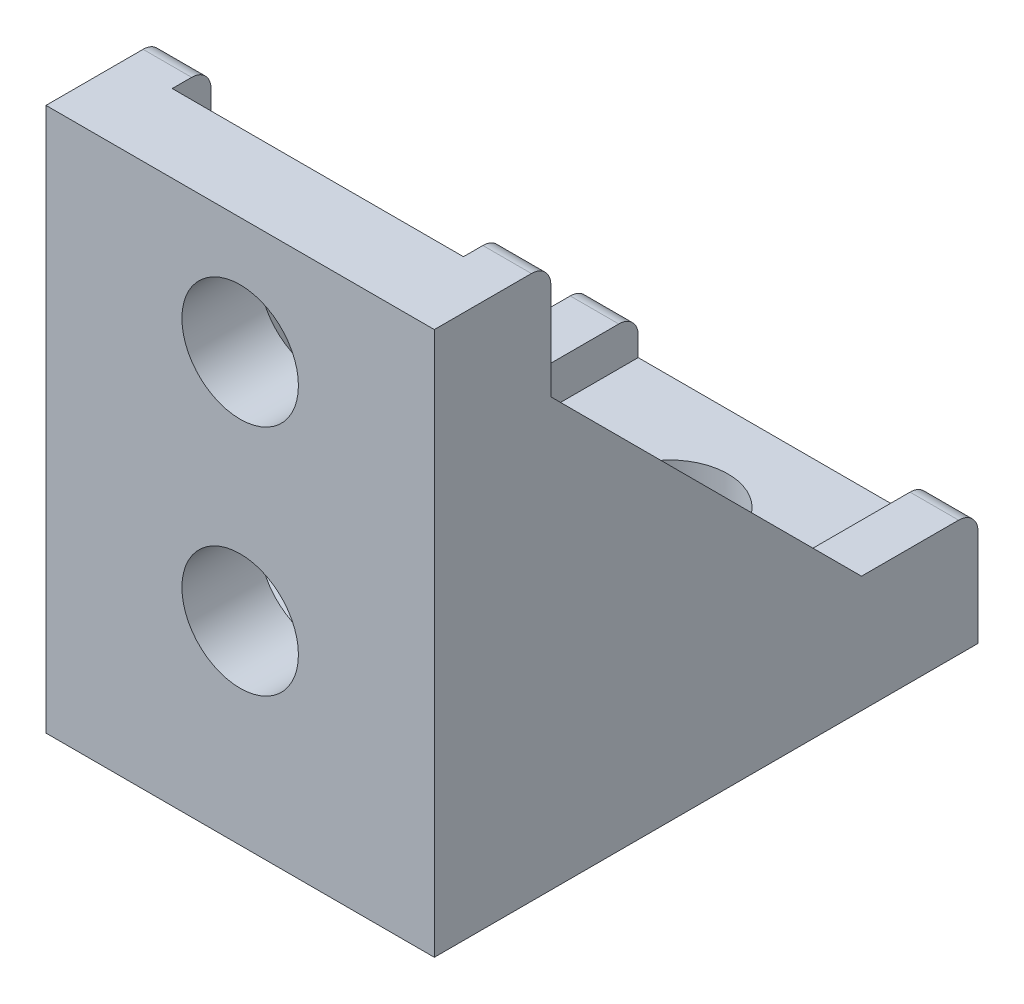
ISO-10303-21;
HEADER;
FILE_DESCRIPTION(('STEP AP214'),'2;1');
FILE_NAME('part.step','',(''),(''),'','','');
FILE_SCHEMA(('AUTOMOTIVE_DESIGN { 1 0 10303 214 1 1 1 1 }'));
ENDSEC;
DATA;
#1=APPLICATION_CONTEXT('core data for automotive mechanical design processes');
#2=APPLICATION_PROTOCOL_DEFINITION('international standard','automotive_design',2000,#1);
#3=PRODUCT_CONTEXT('',#1,'mechanical');
#4=PRODUCT('Part','Part','',(#3));
#5=PRODUCT_RELATED_PRODUCT_CATEGORY('part','',(#4));
#6=PRODUCT_DEFINITION_FORMATION('','',#4);
#7=PRODUCT_DEFINITION_CONTEXT('part definition',#1,'design');
#8=PRODUCT_DEFINITION('design','',#6,#7);
#9=PRODUCT_DEFINITION_SHAPE('','',#8);
#10=(LENGTH_UNIT() NAMED_UNIT(*) SI_UNIT(.MILLI.,.METRE.));
#11=(NAMED_UNIT(*) PLANE_ANGLE_UNIT() SI_UNIT($,.RADIAN.));
#12=(NAMED_UNIT(*) SI_UNIT($,.STERADIAN.) SOLID_ANGLE_UNIT());
#13=UNCERTAINTY_MEASURE_WITH_UNIT(LENGTH_MEASURE(1.E-05),#10,'distance_accuracy_value','');
#14=(GEOMETRIC_REPRESENTATION_CONTEXT(3) GLOBAL_UNCERTAINTY_ASSIGNED_CONTEXT((#13)) GLOBAL_UNIT_ASSIGNED_CONTEXT((#10,
#11,#12)) REPRESENTATION_CONTEXT('',''));
#15=CARTESIAN_POINT('',(0.,0.,0.));
#16=DIRECTION('',(0.,0.,1.));
#17=DIRECTION('',(1.,0.,0.));
#18=AXIS2_PLACEMENT_3D('',#15,#16,#17);
#19=CARTESIAN_POINT('',(0.,-6.00000000000142,-22.1235464085107));
#20=DIRECTION('',(0.,1.,0.));
#21=DIRECTION('',(0.,0.,1.));
#22=AXIS2_PLACEMENT_3D('',#19,#20,#21);
#23=CYLINDRICAL_SURFACE('',#22,3.);
#24=CARTESIAN_POINT('',(0.,3.99999999999858,-22.1235464085107));
#25=DIRECTION('',(0.,1.,0.));
#26=DIRECTION('',(0.,0.,1.));
#27=AXIS2_PLACEMENT_3D('',#24,#25,#26);
#28=CIRCLE('',#27,3.);
#29=CARTESIAN_POINT('',(0.,3.99999999999858,-19.1235464085107));
#30=VERTEX_POINT('',#29);
#31=EDGE_CURVE('E754',#30,#30,#28,.T.);
#32=ORIENTED_EDGE('',*,*,#31,.T.);
#33=EDGE_LOOP('',(#32));
#34=FACE_BOUND('',#33,.T.);
#35=CARTESIAN_POINT('',(0.,-1.94289029309402E-13,-22.1235464085107));
#36=DIRECTION('',(0.,1.,0.));
#37=DIRECTION('',(-1.,0.,0.));
#38=AXIS2_PLACEMENT_3D('',#35,#36,#37);
#39=CIRCLE('',#38,3.);
#40=CARTESIAN_POINT('',(-3.,-4.2717565595929E-13,-22.1235464085107));
#41=VERTEX_POINT('',#40);
#42=EDGE_CURVE('E750',#41,#41,#39,.T.);
#43=ORIENTED_EDGE('',*,*,#42,.F.);
#44=EDGE_LOOP('',(#43));
#45=FACE_BOUND('',#44,.T.);
#46=ADVANCED_FACE('F43',(#34,#45),#23,.F.);
#47=CARTESIAN_POINT('',(0.,-1.94289029309402E-13,0.));
#48=DIRECTION('',(0.,1.,0.));
#49=DIRECTION('',(-1.,0.,0.));
#50=AXIS2_PLACEMENT_3D('',#47,#48,#49);
#51=PLANE('',#50);
#52=ORIENTED_EDGE('',*,*,#42,.T.);
#53=EDGE_LOOP('',(#52));
#54=FACE_BOUND('',#53,.T.);
#55=CARTESIAN_POINT('',(0.,-1.94289029309402E-13,-10.0000000000007));
#56=DIRECTION('',(0.,1.,0.));
#57=DIRECTION('',(-1.,0.,0.));
#58=AXIS2_PLACEMENT_3D('',#55,#56,#57);
#59=CIRCLE('',#58,3.);
#60=CARTESIAN_POINT('',(-3.,-4.2717565595929E-13,-10.0000000000007));
#61=VERTEX_POINT('',#60);
#62=EDGE_CURVE('E743',#61,#61,#59,.T.);
#63=ORIENTED_EDGE('',*,*,#62,.T.);
#64=EDGE_LOOP('',(#63));
#65=FACE_BOUND('',#64,.T.);
#66=DIRECTION('',(1.,0.,0.));
#67=VECTOR('',#66,1.);
#68=CARTESIAN_POINT('',(10.0000000000009,5.81999726190219E-13,-28.));
#69=LINE('',#68,#67);
#70=CARTESIAN_POINT('',(-9.99999999999907,-9.70577784809024E-13,-28.));
#71=VERTEX_POINT('',#70);
#72=CARTESIAN_POINT('',(10.0000000000009,5.81999726190219E-13,-28.));
#73=VERTEX_POINT('',#72);
#74=EDGE_CURVE('E259',#71,#73,#69,.T.);
#75=ORIENTED_EDGE('',*,*,#74,.T.);
#76=DIRECTION('',(0.,0.,1.));
#77=VECTOR('',#76,1.);
#78=CARTESIAN_POINT('',(10.0000000000009,5.81999726190219E-13,0.));
#79=LINE('',#78,#77);
#80=CARTESIAN_POINT('',(10.0000000000009,5.81999726190219E-13,0.));
#81=VERTEX_POINT('',#80);
#82=EDGE_CURVE('E263',#73,#81,#79,.T.);
#83=ORIENTED_EDGE('',*,*,#82,.T.);
#84=DIRECTION('',(-1.,0.,0.));
#85=VECTOR('',#84,1.);
#86=CARTESIAN_POINT('',(-9.99999999999892,-9.70577784809024E-13,1.91624494050302E-13));
#87=LINE('',#86,#85);
#88=CARTESIAN_POINT('',(-9.99999999999892,-9.70577784809024E-13,1.91624494050302E-13));
#89=VERTEX_POINT('',#88);
#90=EDGE_CURVE('E267',#81,#89,#87,.T.);
#91=ORIENTED_EDGE('',*,*,#90,.T.);
#92=DIRECTION('',(0.,0.,-1.));
#93=VECTOR('',#92,1.);
#94=CARTESIAN_POINT('',(-9.99999999999907,-9.70577784809024E-13,-28.));
#95=LINE('',#94,#93);
#96=EDGE_CURVE('E255',#89,#71,#95,.T.);
#97=ORIENTED_EDGE('',*,*,#96,.T.);
#98=EDGE_LOOP('',(#75,#83,#91,#97));
#99=FACE_BOUND('',#98,.T.);
#100=ADVANCED_FACE('F395',(#54,#65,#99),#51,.F.);
#101=CARTESIAN_POINT('',(0.,0.,-6.00000000000071));
#102=DIRECTION('',(0.,0.,1.));
#103=DIRECTION('',(1.,0.,0.));
#104=AXIS2_PLACEMENT_3D('',#101,#102,#103);
#105=PLANE('',#104);
#106=DIRECTION('',(0.,1.,0.));
#107=VECTOR('',#106,1.);
#108=CARTESIAN_POINT('',(7.50000000000009,5.99999999999793,-6.00000000000073));
#109=LINE('',#108,#107);
#110=CARTESIAN_POINT('',(7.50000000000009,21.9999999999992,-6.00000000000072));
#111=VERTEX_POINT('',#110);
#112=CARTESIAN_POINT('',(7.50000000000009,27.0000000000001,-6.00000000000071));
#113=VERTEX_POINT('',#112);
#114=EDGE_CURVE('E242',#111,#113,#109,.T.);
#115=ORIENTED_EDGE('',*,*,#114,.T.);
#116=DIRECTION('',(-1.,0.,0.));
#117=VECTOR('',#116,1.);
#118=CARTESIAN_POINT('',(9.99999999999864,26.9999999999999,-6.00000000000071));
#119=LINE('',#118,#117);
#120=CARTESIAN_POINT('',(9.99999999999864,26.9999999999999,-6.00000000000048));
#121=VERTEX_POINT('',#120);
#122=EDGE_CURVE('E11',#113,#121,#119,.F.);
#123=ORIENTED_EDGE('',*,*,#122,.T.);
#124=DIRECTION('',(0.,-1.,0.));
#125=VECTOR('',#124,1.);
#126=CARTESIAN_POINT('',(9.99999999999872,27.9999999999999,-6.00000000000048));
#127=LINE('',#126,#125);
#128=CARTESIAN_POINT('',(10.0000000000006,21.9999999999989,-6.00000000000097));
#129=VERTEX_POINT('',#128);
#130=EDGE_CURVE('E290',#121,#129,#127,.T.);
#131=ORIENTED_EDGE('',*,*,#130,.T.);
#132=DIRECTION('',(-1.,0.,0.));
#133=VECTOR('',#132,1.);
#134=CARTESIAN_POINT('',(10.0000000000006,21.9999999999989,-6.00000000000097));
#135=LINE('',#134,#133);
#136=EDGE_CURVE('E301',#129,#111,#135,.T.);
#137=ORIENTED_EDGE('',*,*,#136,.T.);
#138=EDGE_LOOP('',(#115,#123,#131,#137));
#139=FACE_BOUND('',#138,.T.);
#140=ADVANCED_FACE('F408',(#139),#105,.F.);
#141=CARTESIAN_POINT('',(-9.99999999999985,22.0000000000007,-6.00000000000071));
#142=DIRECTION('',(-1.,0.,0.));
#143=DIRECTION('',(0.,-1.,0.));
#144=AXIS2_PLACEMENT_3D('',#141,#142,#143);
#145=PLANE('',#144);
#146=DIRECTION('',(0.,0.,1.));
#147=VECTOR('',#146,1.);
#148=CARTESIAN_POINT('',(-9.99999999999985,5.99999999999859,-28.));
#149=LINE('',#148,#147);
#150=CARTESIAN_POINT('',(-9.99999999999985,5.99999999999859,-26.9999999999998));
#151=VERTEX_POINT('',#150);
#152=CARTESIAN_POINT('',(-9.99999999999985,5.99999999999859,-22.));
#153=VERTEX_POINT('',#152);
#154=EDGE_CURVE('E169',#151,#153,#149,.T.);
#155=ORIENTED_EDGE('',*,*,#154,.F.);
#156=CARTESIAN_POINT('',(-9.99999999999985,4.99999999999859,-26.9999999999998));
#157=DIRECTION('',(-1.,0.,0.));
#158=DIRECTION('',(0.,-1.,0.));
#159=AXIS2_PLACEMENT_3D('',#156,#157,#158);
#160=CIRCLE('',#159,1.);
#161=CARTESIAN_POINT('',(-10.0000000000004,4.99999999999859,-27.9999999999998));
#162=VERTEX_POINT('',#161);
#163=EDGE_CURVE('E332',#151,#162,#160,.T.);
#164=ORIENTED_EDGE('',*,*,#163,.T.);
#165=DIRECTION('',(0.,1.,0.));
#166=VECTOR('',#165,1.);
#167=CARTESIAN_POINT('',(-10.0000000000005,21.9999999999993,-27.9999999999998));
#168=LINE('',#167,#166);
#169=EDGE_CURVE('E309',#71,#162,#168,.T.);
#170=ORIENTED_EDGE('',*,*,#169,.F.);
#171=ORIENTED_EDGE('',*,*,#96,.F.);
#172=DIRECTION('',(0.,-1.,0.));
#173=VECTOR('',#172,1.);
#174=CARTESIAN_POINT('',(-9.99999999999985,22.0000000000007,0.));
#175=LINE('',#174,#173);
#176=CARTESIAN_POINT('',(-10.0000000000016,28.0000000000014,-5.80702153030188E-13));
#177=VERTEX_POINT('',#176);
#178=EDGE_CURVE('E313',#177,#89,#175,.T.);
#179=ORIENTED_EDGE('',*,*,#178,.F.);
#180=DIRECTION('',(0.,0.,1.));
#181=VECTOR('',#180,1.);
#182=CARTESIAN_POINT('',(-10.0000000000016,28.0000000000014,-5.80702153030188E-13));
#183=LINE('',#182,#181);
#184=CARTESIAN_POINT('',(-10.0000000000016,28.0000000000014,-5.00000000000044));
#185=VERTEX_POINT('',#184);
#186=EDGE_CURVE('E280',#185,#177,#183,.T.);
#187=ORIENTED_EDGE('',*,*,#186,.F.);
#188=CARTESIAN_POINT('',(-9.99999999999985,27.0000000000015,-5.00000000000044));
#189=DIRECTION('',(-1.,0.,0.));
#190=DIRECTION('',(0.,-1.,0.));
#191=AXIS2_PLACEMENT_3D('',#188,#189,#190);
#192=CIRCLE('',#191,1.);
#193=CARTESIAN_POINT('',(-9.99999999999985,27.0000000000014,-6.00000000000044));
#194=VERTEX_POINT('',#193);
#195=EDGE_CURVE('E329',#185,#194,#192,.T.);
#196=ORIENTED_EDGE('',*,*,#195,.T.);
#197=DIRECTION('',(0.,1.,0.));
#198=VECTOR('',#197,1.);
#199=CARTESIAN_POINT('',(-9.99999999999985,21.9999999999984,-6.00000000000023));
#200=LINE('',#199,#198);
#201=CARTESIAN_POINT('',(-9.99999999999985,21.9999999999984,-6.00000000000023));
#202=VERTEX_POINT('',#201);
#203=EDGE_CURVE('E192',#202,#194,#200,.T.);
#204=ORIENTED_EDGE('',*,*,#203,.F.);
#205=DIRECTION('',(0.,0.707106781186547,0.707106781186547));
#206=VECTOR('',#205,1.);
#207=CARTESIAN_POINT('',(-9.99999999999985,5.99999999999859,-22.));
#208=LINE('',#207,#206);
#209=EDGE_CURVE('E179',#153,#202,#208,.T.);
#210=ORIENTED_EDGE('',*,*,#209,.F.);
#211=EDGE_LOOP('',(#155,#164,#170,#171,#179,#187,#196,#204,#210));
#212=FACE_BOUND('',#211,.T.);
#213=ADVANCED_FACE('F194',(#212),#145,.T.);
#214=CARTESIAN_POINT('',(0.,0.,0.));
#215=DIRECTION('',(0.,0.,1.));
#216=DIRECTION('',(1.,0.,0.));
#217=AXIS2_PLACEMENT_3D('',#214,#215,#216);
#218=PLANE('',#217);
#219=CARTESIAN_POINT('',(0.,21.9999999999983,0.));
#220=DIRECTION('',(0.,0.,1.));
#221=DIRECTION('',(1.,0.,0.));
#222=AXIS2_PLACEMENT_3D('',#219,#220,#221);
#223=CIRCLE('',#222,3.);
#224=CARTESIAN_POINT('',(3.,21.9999999999983,0.));
#225=VERTEX_POINT('',#224);
#226=EDGE_CURVE('E731',#225,#225,#223,.T.);
#227=ORIENTED_EDGE('',*,*,#226,.F.);
#228=EDGE_LOOP('',(#227));
#229=FACE_BOUND('',#228,.T.);
#230=CARTESIAN_POINT('',(0.,9.99999999999827,0.));
#231=DIRECTION('',(0.,0.,1.));
#232=DIRECTION('',(1.,0.,0.));
#233=AXIS2_PLACEMENT_3D('',#230,#231,#232);
#234=CIRCLE('',#233,3.);
#235=CARTESIAN_POINT('',(3.,9.99999999999827,0.));
#236=VERTEX_POINT('',#235);
#237=EDGE_CURVE('E180',#236,#236,#234,.T.);
#238=ORIENTED_EDGE('',*,*,#237,.F.);
#239=EDGE_LOOP('',(#238));
#240=FACE_BOUND('',#239,.T.);
#241=ORIENTED_EDGE('',*,*,#178,.T.);
#242=ORIENTED_EDGE('',*,*,#90,.F.);
#243=DIRECTION('',(0.,-1.,0.));
#244=VECTOR('',#243,1.);
#245=CARTESIAN_POINT('',(10.0000000000004,5.99999999999989,0.));
#246=LINE('',#245,#244);
#247=CARTESIAN_POINT('',(9.9999999999989,27.9999999999999,-5.80702153030188E-13));
#248=VERTEX_POINT('',#247);
#249=EDGE_CURVE('E294',#248,#81,#246,.T.);
#250=ORIENTED_EDGE('',*,*,#249,.F.);
#251=DIRECTION('',(1.,0.,0.));
#252=VECTOR('',#251,1.);
#253=CARTESIAN_POINT('',(9.9999999999989,27.9999999999999,-5.80702153030188E-13));
#254=LINE('',#253,#252);
#255=EDGE_CURVE('E283',#177,#248,#254,.T.);
#256=ORIENTED_EDGE('',*,*,#255,.F.);
#257=EDGE_LOOP('',(#241,#242,#250,#256));
#258=FACE_BOUND('',#257,.T.);
#259=ADVANCED_FACE('F399',(#229,#240,#258),#218,.T.);
#260=CARTESIAN_POINT('',(-7.50000000000009,5.9999999999988,-27.9999999999999));
#261=DIRECTION('',(-1.,0.,0.));
#262=DIRECTION('',(0.,0.,1.));
#263=AXIS2_PLACEMENT_3D('',#260,#261,#262);
#264=PLANE('',#263);
#265=DIRECTION('',(0.,-1.,0.));
#266=VECTOR('',#265,1.);
#267=CARTESIAN_POINT('',(-7.50000000000009,5.9999999999988,-27.9999999999999));
#268=LINE('',#267,#266);
#269=CARTESIAN_POINT('',(-7.50000000000009,4.99999999999859,-27.9999999999999));
#270=VERTEX_POINT('',#269);
#271=CARTESIAN_POINT('',(-7.50000000000015,3.99999999999858,-28.0000000000006));
#272=VERTEX_POINT('',#271);
#273=EDGE_CURVE('E306',#270,#272,#268,.T.);
#274=ORIENTED_EDGE('',*,*,#273,.F.);
#275=CARTESIAN_POINT('',(-7.50000000000008,4.99999999999859,-26.9999999999999));
#276=DIRECTION('',(-1.,0.,0.));
#277=DIRECTION('',(0.,0.,1.));
#278=AXIS2_PLACEMENT_3D('',#275,#276,#277);
#279=CIRCLE('',#278,1.);
#280=CARTESIAN_POINT('',(-7.50000000000008,5.9999999999988,-26.9999999999999));
#281=VERTEX_POINT('',#280);
#282=EDGE_CURVE('E345',#270,#281,#279,.F.);
#283=ORIENTED_EDGE('',*,*,#282,.T.);
#284=DIRECTION('',(0.,0.,1.));
#285=VECTOR('',#284,1.);
#286=CARTESIAN_POINT('',(-7.50000000000009,5.9999999999988,-27.9999999999999));
#287=LINE('',#286,#285);
#288=CARTESIAN_POINT('',(-7.50000000000006,5.99999999999859,-22.));
#289=VERTEX_POINT('',#288);
#290=EDGE_CURVE('E212',#281,#289,#287,.T.);
#291=ORIENTED_EDGE('',*,*,#290,.T.);
#292=DIRECTION('',(0.,0.707106781186548,0.707106781186548));
#293=VECTOR('',#292,1.);
#294=CARTESIAN_POINT('',(-7.50000000000006,2.99999999999876,-24.9999999999998));
#295=LINE('',#294,#293);
#296=CARTESIAN_POINT('',(-7.49999999999993,21.9999999999984,-6.00000000000023));
#297=VERTEX_POINT('',#296);
#298=EDGE_CURVE('E189',#289,#297,#295,.T.);
#299=ORIENTED_EDGE('',*,*,#298,.T.);
#300=DIRECTION('',(0.,1.,0.));
#301=VECTOR('',#300,1.);
#302=CARTESIAN_POINT('',(-7.49999999999985,5.9999999999997,-5.99999999999958));
#303=LINE('',#302,#301);
#304=CARTESIAN_POINT('',(-7.49999999999983,27.0000000000012,-6.00000000000044));
#305=VERTEX_POINT('',#304);
#306=EDGE_CURVE('E208',#297,#305,#303,.T.);
#307=ORIENTED_EDGE('',*,*,#306,.T.);
#308=CARTESIAN_POINT('',(-7.49999999999982,27.0000000000013,-5.00000000000044));
#309=DIRECTION('',(-1.,0.,0.));
#310=DIRECTION('',(0.,0.,1.));
#311=AXIS2_PLACEMENT_3D('',#308,#309,#310);
#312=CIRCLE('',#311,1.);
#313=CARTESIAN_POINT('',(-7.50000000000143,28.0000000000013,-5.00000000000044));
#314=VERTEX_POINT('',#313);
#315=EDGE_CURVE('E342',#305,#314,#312,.F.);
#316=ORIENTED_EDGE('',*,*,#315,.T.);
#317=DIRECTION('',(0.,0.,-1.));
#318=VECTOR('',#317,1.);
#319=CARTESIAN_POINT('',(-7.50000000000119,28.0000000000013,-28.));
#320=LINE('',#319,#318);
#321=CARTESIAN_POINT('',(-7.50000000000014,27.999999999998,-4.00000000000069));
#322=VERTEX_POINT('',#321);
#323=EDGE_CURVE('E276',#322,#314,#320,.T.);
#324=ORIENTED_EDGE('',*,*,#323,.F.);
#325=DIRECTION('',(0.,-1.,0.));
#326=VECTOR('',#325,1.);
#327=CARTESIAN_POINT('',(-7.50000000000014,27.999999999998,-4.00000000000069));
#328=LINE('',#327,#326);
#329=CARTESIAN_POINT('',(-7.50000000000016,3.99999999999859,-4.00000000000056));
#330=VERTEX_POINT('',#329);
#331=EDGE_CURVE('E235',#322,#330,#328,.T.);
#332=ORIENTED_EDGE('',*,*,#331,.T.);
#333=DIRECTION('',(0.,0.,-1.));
#334=VECTOR('',#333,1.);
#335=CARTESIAN_POINT('',(-7.50000000000016,3.99999999999859,-4.00000000000056));
#336=LINE('',#335,#334);
#337=EDGE_CURVE('E225',#330,#272,#336,.T.);
#338=ORIENTED_EDGE('',*,*,#337,.T.);
#339=EDGE_LOOP('',(#274,#283,#291,#299,#307,#316,#324,#332,#338));
#340=FACE_BOUND('',#339,.T.);
#341=ADVANCED_FACE('F384',(#340),#264,.F.);
#342=CARTESIAN_POINT('',(-3.14645135343223E-13,0.,-28.));
#343=DIRECTION('',(0.,0.,1.));
#344=DIRECTION('',(1.,0.,0.));
#345=AXIS2_PLACEMENT_3D('',#342,#343,#344);
#346=PLANE('',#345);
#347=DIRECTION('',(0.,1.,0.));
#348=VECTOR('',#347,1.);
#349=CARTESIAN_POINT('',(10.0000000000009,5.81999726190219E-13,-28.));
#350=LINE('',#349,#348);
#351=CARTESIAN_POINT('',(10.0000000000005,4.99999999999945,-28.));
#352=VERTEX_POINT('',#351);
#353=EDGE_CURVE('E270',#73,#352,#350,.T.);
#354=ORIENTED_EDGE('',*,*,#353,.F.);
#355=ORIENTED_EDGE('',*,*,#74,.F.);
#356=ORIENTED_EDGE('',*,*,#169,.T.);
#357=DIRECTION('',(-1.,0.,0.));
#358=VECTOR('',#357,1.);
#359=CARTESIAN_POINT('',(-3.15729337515708E-13,4.99999999999859,-28.));
#360=LINE('',#359,#358);
#361=EDGE_CURVE('E339',#162,#270,#360,.F.);
#362=ORIENTED_EDGE('',*,*,#361,.T.);
#363=ORIENTED_EDGE('',*,*,#273,.T.);
#364=DIRECTION('',(1.,0.,0.));
#365=VECTOR('',#364,1.);
#366=CARTESIAN_POINT('',(-7.50000000000015,3.99999999999858,-28.0000000000006));
#367=LINE('',#366,#365);
#368=CARTESIAN_POINT('',(7.50000000000017,3.99999999999858,-28.0000000000005));
#369=VERTEX_POINT('',#368);
#370=EDGE_CURVE('E221',#272,#369,#367,.T.);
#371=ORIENTED_EDGE('',*,*,#370,.T.);
#372=DIRECTION('',(0.,-1.,0.));
#373=VECTOR('',#372,1.);
#374=CARTESIAN_POINT('',(7.50000000000017,34.3019433961686,-28.0000000000005));
#375=LINE('',#374,#373);
#376=CARTESIAN_POINT('',(7.50000000000017,4.99999999999926,-28.0000000000005));
#377=VERTEX_POINT('',#376);
#378=EDGE_CURVE('E220',#377,#369,#375,.T.);
#379=ORIENTED_EDGE('',*,*,#378,.F.);
#380=DIRECTION('',(1.,0.,0.));
#381=VECTOR('',#380,1.);
#382=CARTESIAN_POINT('',(10.0000000000005,4.99999999999945,-28.0000000000001));
#383=LINE('',#382,#381);
#384=EDGE_CURVE('E335',#377,#352,#383,.T.);
#385=ORIENTED_EDGE('',*,*,#384,.T.);
#386=EDGE_LOOP('',(#354,#355,#356,#362,#363,#371,#379,#385));
#387=FACE_BOUND('',#386,.T.);
#388=ADVANCED_FACE('F392',(#387),#346,.F.);
#389=CARTESIAN_POINT('',(7.50000000000016,0.,0.));
#390=DIRECTION('',(1.,0.,0.));
#391=DIRECTION('',(0.,1.,0.));
#392=AXIS2_PLACEMENT_3D('',#389,#390,#391);
#393=PLANE('',#392);
#394=DIRECTION('',(0.,0.,1.));
#395=VECTOR('',#394,1.);
#396=CARTESIAN_POINT('',(7.50000000000017,5.99999999999856,-28.0000000000005));
#397=LINE('',#396,#395);
#398=CARTESIAN_POINT('',(7.50000000000017,5.99999999999856,-27.));
#399=VERTEX_POINT('',#398);
#400=CARTESIAN_POINT('',(7.50000000000015,5.99999999999856,-22.));
#401=VERTEX_POINT('',#400);
#402=EDGE_CURVE('E232',#399,#401,#397,.T.);
#403=ORIENTED_EDGE('',*,*,#402,.F.);
#404=CARTESIAN_POINT('',(7.50000000000021,4.99999999999925,-27.));
#405=DIRECTION('',(1.,0.,0.));
#406=DIRECTION('',(0.,1.,0.));
#407=AXIS2_PLACEMENT_3D('',#404,#405,#406);
#408=CIRCLE('',#407,1.);
#409=EDGE_CURVE('E359',#399,#377,#408,.F.);
#410=ORIENTED_EDGE('',*,*,#409,.T.);
#411=ORIENTED_EDGE('',*,*,#378,.T.);
#412=DIRECTION('',(0.,0.,1.));
#413=VECTOR('',#412,1.);
#414=CARTESIAN_POINT('',(7.50000000000017,3.99999999999858,-28.0000000000005));
#415=LINE('',#414,#413);
#416=CARTESIAN_POINT('',(7.50000000000009,3.99999999999859,-4.00000000000045));
#417=VERTEX_POINT('',#416);
#418=EDGE_CURVE('E216',#369,#417,#415,.T.);
#419=ORIENTED_EDGE('',*,*,#418,.T.);
#420=DIRECTION('',(0.,1.,0.));
#421=VECTOR('',#420,1.);
#422=CARTESIAN_POINT('',(7.50000000000009,5.99999999999795,-4.00000000000069));
#423=LINE('',#422,#421);
#424=CARTESIAN_POINT('',(7.50000000000009,27.999999999998,-4.00000000000069));
#425=VERTEX_POINT('',#424);
#426=EDGE_CURVE('E243',#417,#425,#423,.T.);
#427=ORIENTED_EDGE('',*,*,#426,.T.);
#428=DIRECTION('',(0.,0.,1.));
#429=VECTOR('',#428,1.);
#430=CARTESIAN_POINT('',(7.50000000000009,27.999999999998,-32.6270539113896));
#431=LINE('',#430,#429);
#432=CARTESIAN_POINT('',(7.50000000000009,27.999999999998,-5.00000000000071));
#433=VERTEX_POINT('',#432);
#434=EDGE_CURVE('E251',#433,#425,#431,.T.);
#435=ORIENTED_EDGE('',*,*,#434,.F.);
#436=CARTESIAN_POINT('',(7.50000000000046,27.0000000000001,-5.00000000000071));
#437=DIRECTION('',(1.,0.,0.));
#438=DIRECTION('',(0.,1.,0.));
#439=AXIS2_PLACEMENT_3D('',#436,#437,#438);
#440=CIRCLE('',#439,1.);
#441=EDGE_CURVE('E59',#433,#113,#440,.F.);
#442=ORIENTED_EDGE('',*,*,#441,.T.);
#443=ORIENTED_EDGE('',*,*,#114,.F.);
#444=DIRECTION('',(0.,0.707106781186547,0.707106781186548));
#445=VECTOR('',#444,1.);
#446=CARTESIAN_POINT('',(7.5000000000004,21.9999999999989,-6.00000000000097));
#447=LINE('',#446,#445);
#448=EDGE_CURVE('E293',#401,#111,#447,.T.);
#449=ORIENTED_EDGE('',*,*,#448,.F.);
#450=EDGE_LOOP('',(#403,#410,#411,#419,#427,#435,#442,#443,#449));
#451=FACE_BOUND('',#450,.T.);
#452=ADVANCED_FACE('F411',(#451),#393,.F.);
#453=CARTESIAN_POINT('',(10.0000000000006,21.9999999999989,-6.00000000000097));
#454=DIRECTION('',(0.,-0.707106781186548,0.707106781186547));
#455=DIRECTION('',(0.,-0.707106781186547,-0.707106781186548));
#456=AXIS2_PLACEMENT_3D('',#453,#454,#455);
#457=PLANE('',#456);
#458=ORIENTED_EDGE('',*,*,#448,.T.);
#459=ORIENTED_EDGE('',*,*,#136,.F.);
#460=DIRECTION('',(0.,0.707106781186547,0.707106781186548));
#461=VECTOR('',#460,1.);
#462=CARTESIAN_POINT('',(10.0000000000006,21.9999999999989,-6.00000000000097));
#463=LINE('',#462,#461);
#464=CARTESIAN_POINT('',(10.0000000000005,5.99999999999945,-22.));
#465=VERTEX_POINT('',#464);
#466=EDGE_CURVE('E297',#465,#129,#463,.T.);
#467=ORIENTED_EDGE('',*,*,#466,.F.);
#468=DIRECTION('',(-1.,0.,0.));
#469=VECTOR('',#468,1.);
#470=CARTESIAN_POINT('',(10.0000000000004,5.99999999999989,-22.));
#471=LINE('',#470,#469);
#472=EDGE_CURVE('E302',#465,#401,#471,.T.);
#473=ORIENTED_EDGE('',*,*,#472,.T.);
#474=EDGE_LOOP('',(#458,#459,#467,#473));
#475=FACE_BOUND('',#474,.T.);
#476=ADVANCED_FACE('F413',(#475),#457,.F.);
#477=CARTESIAN_POINT('',(10.0000000000004,-1.11672823766017E-13,0.));
#478=DIRECTION('',(1.,0.,0.));
#479=DIRECTION('',(0.,1.,0.));
#480=AXIS2_PLACEMENT_3D('',#477,#478,#479);
#481=PLANE('',#480);
#482=ORIENTED_EDGE('',*,*,#353,.T.);
#483=CARTESIAN_POINT('',(10.0000000000004,4.99999999999945,-27.0000000000001));
#484=DIRECTION('',(1.,0.,0.));
#485=DIRECTION('',(0.,1.,0.));
#486=AXIS2_PLACEMENT_3D('',#483,#484,#485);
#487=CIRCLE('',#486,1.);
#488=CARTESIAN_POINT('',(10.0000000000005,5.99999999999945,-27.0000000000001));
#489=VERTEX_POINT('',#488);
#490=EDGE_CURVE('E351',#352,#489,#487,.T.);
#491=ORIENTED_EDGE('',*,*,#490,.T.);
#492=DIRECTION('',(0.,0.,1.));
#493=VECTOR('',#492,1.);
#494=CARTESIAN_POINT('',(10.0000000000005,5.99999999999945,0.));
#495=LINE('',#494,#493);
#496=EDGE_CURVE('E260',#489,#465,#495,.T.);
#497=ORIENTED_EDGE('',*,*,#496,.T.);
#498=ORIENTED_EDGE('',*,*,#466,.T.);
#499=ORIENTED_EDGE('',*,*,#130,.F.);
#500=CARTESIAN_POINT('',(10.0000000000007,26.9999999999999,-5.00000000000071));
#501=DIRECTION('',(1.,0.,0.));
#502=DIRECTION('',(0.,1.,0.));
#503=AXIS2_PLACEMENT_3D('',#500,#501,#502);
#504=CIRCLE('',#503,1.);
#505=CARTESIAN_POINT('',(9.99999999999875,27.9999999999999,-5.00000000000071));
#506=VERTEX_POINT('',#505);
#507=EDGE_CURVE('E348',#121,#506,#504,.T.);
#508=ORIENTED_EDGE('',*,*,#507,.T.);
#509=DIRECTION('',(0.,0.,-1.));
#510=VECTOR('',#509,1.);
#511=CARTESIAN_POINT('',(9.99999999999872,27.9999999999999,-6.00000000000048));
#512=LINE('',#511,#510);
#513=EDGE_CURVE('E286',#248,#506,#512,.T.);
#514=ORIENTED_EDGE('',*,*,#513,.F.);
#515=ORIENTED_EDGE('',*,*,#249,.T.);
#516=ORIENTED_EDGE('',*,*,#82,.F.);
#517=EDGE_LOOP('',(#482,#491,#497,#498,#499,#508,#514,#515,#516));
#518=FACE_BOUND('',#517,.T.);
#519=ADVANCED_FACE('F404',(#518),#481,.T.);
#520=CARTESIAN_POINT('',(2.23709939461971E-12,28.0000000000007,0.));
#521=DIRECTION('',(0.,1.,0.));
#522=DIRECTION('',(-1.,0.,0.));
#523=AXIS2_PLACEMENT_3D('',#520,#521,#522);
#524=PLANE('',#523);
#525=ORIENTED_EDGE('',*,*,#434,.T.);
#526=DIRECTION('',(-1.,0.,0.));
#527=VECTOR('',#526,1.);
#528=CARTESIAN_POINT('',(7.50000000000009,27.999999999998,-4.00000000000069));
#529=LINE('',#528,#527);
#530=EDGE_CURVE('E238',#425,#322,#529,.T.);
#531=ORIENTED_EDGE('',*,*,#530,.T.);
#532=ORIENTED_EDGE('',*,*,#323,.T.);
#533=DIRECTION('',(1.,0.,0.));
#534=VECTOR('',#533,1.);
#535=CARTESIAN_POINT('',(-10.0000000000016,28.0000000000014,-5.00000000000044));
#536=LINE('',#535,#534);
#537=EDGE_CURVE('E52',#314,#185,#536,.F.);
#538=ORIENTED_EDGE('',*,*,#537,.T.);
#539=ORIENTED_EDGE('',*,*,#186,.T.);
#540=ORIENTED_EDGE('',*,*,#255,.T.);
#541=ORIENTED_EDGE('',*,*,#513,.T.);
#542=DIRECTION('',(-1.,0.,0.));
#543=VECTOR('',#542,1.);
#544=CARTESIAN_POINT('',(7.50000000000009,28.0000000000001,-5.00000000000071));
#545=LINE('',#544,#543);
#546=EDGE_CURVE('E366',#506,#433,#545,.T.);
#547=ORIENTED_EDGE('',*,*,#546,.T.);
#548=EDGE_LOOP('',(#525,#531,#532,#538,#539,#540,#541,#547));
#549=FACE_BOUND('',#548,.T.);
#550=ADVANCED_FACE('F372',(#549),#524,.T.);
#551=CARTESIAN_POINT('',(-4.65773253299673E-13,5.99999999999867,0.));
#552=DIRECTION('',(0.,1.,0.));
#553=DIRECTION('',(-1.,0.,0.));
#554=AXIS2_PLACEMENT_3D('',#551,#552,#553);
#555=PLANE('',#554);
#556=ORIENTED_EDGE('',*,*,#496,.F.);
#557=DIRECTION('',(1.,0.,0.));
#558=VECTOR('',#557,1.);
#559=CARTESIAN_POINT('',(7.50000000000018,5.99999999999925,-27.));
#560=LINE('',#559,#558);
#561=EDGE_CURVE('E354',#489,#399,#560,.F.);
#562=ORIENTED_EDGE('',*,*,#561,.T.);
#563=ORIENTED_EDGE('',*,*,#402,.T.);
#564=ORIENTED_EDGE('',*,*,#472,.F.);
#565=EDGE_LOOP('',(#556,#562,#563,#564));
#566=FACE_BOUND('',#565,.T.);
#567=ADVANCED_FACE('F417',(#566),#555,.T.);
#568=CARTESIAN_POINT('',(0.,0.,-4.00000000000069));
#569=DIRECTION('',(0.,0.,1.));
#570=DIRECTION('',(1.,0.,0.));
#571=AXIS2_PLACEMENT_3D('',#568,#569,#570);
#572=PLANE('',#571);
#573=CARTESIAN_POINT('',(0.,21.9999999999983,-4.00000000000069));
#574=DIRECTION('',(0.,0.,-1.));
#575=DIRECTION('',(-1.,0.,0.));
#576=AXIS2_PLACEMENT_3D('',#573,#574,#575);
#577=CIRCLE('',#576,3.);
#578=CARTESIAN_POINT('',(-3.,21.9999999999983,-4.00000000000069));
#579=VERTEX_POINT('',#578);
#580=EDGE_CURVE('E736',#579,#579,#577,.T.);
#581=ORIENTED_EDGE('',*,*,#580,.F.);
#582=EDGE_LOOP('',(#581));
#583=FACE_BOUND('',#582,.T.);
#584=CARTESIAN_POINT('',(0.,9.99999999999827,-4.00000000000069));
#585=DIRECTION('',(0.,0.,-1.));
#586=DIRECTION('',(-1.,0.,0.));
#587=AXIS2_PLACEMENT_3D('',#584,#585,#586);
#588=CIRCLE('',#587,3.);
#589=CARTESIAN_POINT('',(-3.,9.99999999999827,-4.00000000000069));
#590=VERTEX_POINT('',#589);
#591=EDGE_CURVE('E739',#590,#590,#588,.T.);
#592=ORIENTED_EDGE('',*,*,#591,.F.);
#593=EDGE_LOOP('',(#592));
#594=FACE_BOUND('',#593,.T.);
#595=ORIENTED_EDGE('',*,*,#331,.F.);
#596=ORIENTED_EDGE('',*,*,#530,.F.);
#597=ORIENTED_EDGE('',*,*,#426,.F.);
#598=DIRECTION('',(-1.,0.,0.));
#599=VECTOR('',#598,1.);
#600=CARTESIAN_POINT('',(7.50000000000009,3.99999999999859,-4.00000000000045));
#601=LINE('',#600,#599);
#602=EDGE_CURVE('E215',#417,#330,#601,.T.);
#603=ORIENTED_EDGE('',*,*,#602,.T.);
#604=EDGE_LOOP('',(#595,#596,#597,#603));
#605=FACE_BOUND('',#604,.T.);
#606=ADVANCED_FACE('F432',(#583,#594,#605),#572,.F.);
#607=CARTESIAN_POINT('',(0.,3.99999999999859,0.));
#608=DIRECTION('',(0.,-1.,0.));
#609=DIRECTION('',(0.,0.,-1.));
#610=AXIS2_PLACEMENT_3D('',#607,#608,#609);
#611=PLANE('',#610);
#612=ORIENTED_EDGE('',*,*,#31,.F.);
#613=EDGE_LOOP('',(#612));
#614=FACE_BOUND('',#613,.T.);
#615=CARTESIAN_POINT('',(0.,3.99999999999859,-10.0000000000007));
#616=DIRECTION('',(0.,1.,0.));
#617=DIRECTION('',(0.,0.,1.));
#618=AXIS2_PLACEMENT_3D('',#615,#616,#617);
#619=CIRCLE('',#618,3.);
#620=CARTESIAN_POINT('',(0.,3.99999999999859,-7.00000000000068));
#621=VERTEX_POINT('',#620);
#622=EDGE_CURVE('E755',#621,#621,#619,.T.);
#623=ORIENTED_EDGE('',*,*,#622,.F.);
#624=EDGE_LOOP('',(#623));
#625=FACE_BOUND('',#624,.T.);
#626=ORIENTED_EDGE('',*,*,#602,.F.);
#627=ORIENTED_EDGE('',*,*,#418,.F.);
#628=ORIENTED_EDGE('',*,*,#370,.F.);
#629=ORIENTED_EDGE('',*,*,#337,.F.);
#630=EDGE_LOOP('',(#626,#627,#628,#629));
#631=FACE_BOUND('',#630,.T.);
#632=ADVANCED_FACE('F428',(#614,#625,#631),#611,.F.);
#633=CARTESIAN_POINT('',(10.0000250000006,5.99999999999859,-28.));
#634=DIRECTION('',(0.,-1.,0.));
#635=DIRECTION('',(1.,0.,0.));
#636=AXIS2_PLACEMENT_3D('',#633,#634,#635);
#637=PLANE('',#636);
#638=ORIENTED_EDGE('',*,*,#290,.F.);
#639=DIRECTION('',(-1.,0.,0.));
#640=VECTOR('',#639,1.);
#641=CARTESIAN_POINT('',(10.0000250000006,5.99999999999859,-27.0000000000001));
#642=LINE('',#641,#640);
#643=EDGE_CURVE('E175',#281,#151,#642,.T.);
#644=ORIENTED_EDGE('',*,*,#643,.T.);
#645=ORIENTED_EDGE('',*,*,#154,.T.);
#646=DIRECTION('',(-1.,0.,0.));
#647=VECTOR('',#646,1.);
#648=CARTESIAN_POINT('',(10.0000250000006,5.99999999999859,-22.));
#649=LINE('',#648,#647);
#650=EDGE_CURVE('E173',#289,#153,#649,.T.);
#651=ORIENTED_EDGE('',*,*,#650,.F.);
#652=EDGE_LOOP('',(#638,#644,#645,#651));
#653=FACE_BOUND('',#652,.T.);
#654=ADVANCED_FACE('F172',(#653),#637,.F.);
#655=CARTESIAN_POINT('',(10.0000250000006,21.9999999999984,-6.00000000000023));
#656=DIRECTION('',(0.,0.,1.));
#657=DIRECTION('',(0.,-1.,0.));
#658=AXIS2_PLACEMENT_3D('',#655,#656,#657);
#659=PLANE('',#658);
#660=ORIENTED_EDGE('',*,*,#203,.T.);
#661=DIRECTION('',(1.,0.,0.));
#662=VECTOR('',#661,1.);
#663=CARTESIAN_POINT('',(-7.50000000000075,27.0000000000012,-6.00000000000044));
#664=LINE('',#663,#662);
#665=EDGE_CURVE('E362',#194,#305,#664,.T.);
#666=ORIENTED_EDGE('',*,*,#665,.T.);
#667=ORIENTED_EDGE('',*,*,#306,.F.);
#668=DIRECTION('',(-1.,0.,0.));
#669=VECTOR('',#668,1.);
#670=CARTESIAN_POINT('',(10.0000250000006,21.9999999999984,-6.00000000000023));
#671=LINE('',#670,#669);
#672=EDGE_CURVE('E191',#297,#202,#671,.T.);
#673=ORIENTED_EDGE('',*,*,#672,.T.);
#674=EDGE_LOOP('',(#660,#666,#667,#673));
#675=FACE_BOUND('',#674,.T.);
#676=ADVANCED_FACE('F381',(#675),#659,.F.);
#677=CARTESIAN_POINT('',(10.0000250000006,5.99999999999859,-22.));
#678=DIRECTION('',(0.,-0.707106781186548,0.707106781186548));
#679=DIRECTION('',(0.,-0.707106781186548,-0.707106781186548));
#680=AXIS2_PLACEMENT_3D('',#677,#678,#679);
#681=PLANE('',#680);
#682=ORIENTED_EDGE('',*,*,#650,.T.);
#683=ORIENTED_EDGE('',*,*,#209,.T.);
#684=ORIENTED_EDGE('',*,*,#672,.F.);
#685=ORIENTED_EDGE('',*,*,#298,.F.);
#686=EDGE_LOOP('',(#682,#683,#684,#685));
#687=FACE_BOUND('',#686,.T.);
#688=ADVANCED_FACE('F185',(#687),#681,.F.);
#689=CARTESIAN_POINT('',(10.0000250000006,4.99999999999859,-27.0000000000001));
#690=DIRECTION('',(-1.,0.,0.));
#691=DIRECTION('',(0.,0.,1.));
#692=AXIS2_PLACEMENT_3D('',#689,#690,#691);
#693=CYLINDRICAL_SURFACE('',#692,1.);
#694=ORIENTED_EDGE('',*,*,#282,.F.);
#695=ORIENTED_EDGE('',*,*,#361,.F.);
#696=ORIENTED_EDGE('',*,*,#163,.F.);
#697=ORIENTED_EDGE('',*,*,#643,.F.);
#698=EDGE_LOOP('',(#694,#695,#696,#697));
#699=FACE_BOUND('',#698,.T.);
#700=ADVANCED_FACE('F387',(#699),#693,.T.);
#701=CARTESIAN_POINT('',(-6.91340338151484E-13,4.99999999999867,-27.));
#702=DIRECTION('',(-1.,0.,0.));
#703=DIRECTION('',(0.,-1.,0.));
#704=AXIS2_PLACEMENT_3D('',#701,#702,#703);
#705=CYLINDRICAL_SURFACE('',#704,1.);
#706=ORIENTED_EDGE('',*,*,#409,.F.);
#707=ORIENTED_EDGE('',*,*,#561,.F.);
#708=ORIENTED_EDGE('',*,*,#490,.F.);
#709=ORIENTED_EDGE('',*,*,#384,.F.);
#710=EDGE_LOOP('',(#706,#707,#708,#709));
#711=FACE_BOUND('',#710,.T.);
#712=ADVANCED_FACE('F423',(#711),#705,.T.);
#713=CARTESIAN_POINT('',(10.000025000001,26.9999999999999,-5.00000000000044));
#714=DIRECTION('',(-1.,0.,0.));
#715=DIRECTION('',(0.,-1.,0.));
#716=AXIS2_PLACEMENT_3D('',#713,#714,#715);
#717=CYLINDRICAL_SURFACE('',#716,1.);
#718=ORIENTED_EDGE('',*,*,#195,.F.);
#719=ORIENTED_EDGE('',*,*,#537,.F.);
#720=ORIENTED_EDGE('',*,*,#315,.F.);
#721=ORIENTED_EDGE('',*,*,#665,.F.);
#722=EDGE_LOOP('',(#718,#719,#720,#721));
#723=FACE_BOUND('',#722,.T.);
#724=ADVANCED_FACE('F379',(#723),#717,.T.);
#725=CARTESIAN_POINT('',(2.15720298766901E-12,27.0000000000007,-5.00000000000071));
#726=DIRECTION('',(1.,0.,0.));
#727=DIRECTION('',(0.,1.,0.));
#728=AXIS2_PLACEMENT_3D('',#725,#726,#727);
#729=CYLINDRICAL_SURFACE('',#728,1.);
#730=ORIENTED_EDGE('',*,*,#507,.F.);
#731=ORIENTED_EDGE('',*,*,#122,.F.);
#732=ORIENTED_EDGE('',*,*,#441,.F.);
#733=ORIENTED_EDGE('',*,*,#546,.F.);
#734=EDGE_LOOP('',(#730,#731,#732,#733));
#735=FACE_BOUND('',#734,.T.);
#736=ADVANCED_FACE('F45',(#735),#729,.T.);
#737=CARTESIAN_POINT('',(0.,21.9999999999983,5.99999999999931));
#738=DIRECTION('',(0.,0.,-1.));
#739=DIRECTION('',(-1.,0.,0.));
#740=AXIS2_PLACEMENT_3D('',#737,#738,#739);
#741=CYLINDRICAL_SURFACE('',#740,3.);
#742=ORIENTED_EDGE('',*,*,#226,.T.);
#743=EDGE_LOOP('',(#742));
#744=FACE_BOUND('',#743,.T.);
#745=ORIENTED_EDGE('',*,*,#580,.T.);
#746=EDGE_LOOP('',(#745));
#747=FACE_BOUND('',#746,.T.);
#748=ADVANCED_FACE('F463',(#744,#747),#741,.F.);
#749=CARTESIAN_POINT('',(0.,9.99999999999827,5.99999999999931));
#750=DIRECTION('',(0.,0.,-1.));
#751=DIRECTION('',(-1.,0.,0.));
#752=AXIS2_PLACEMENT_3D('',#749,#750,#751);
#753=CYLINDRICAL_SURFACE('',#752,3.);
#754=ORIENTED_EDGE('',*,*,#237,.T.);
#755=EDGE_LOOP('',(#754));
#756=FACE_BOUND('',#755,.T.);
#757=ORIENTED_EDGE('',*,*,#591,.T.);
#758=EDGE_LOOP('',(#757));
#759=FACE_BOUND('',#758,.T.);
#760=ADVANCED_FACE('F461',(#756,#759),#753,.F.);
#761=CARTESIAN_POINT('',(0.,-6.00000000000141,-10.0000000000007));
#762=DIRECTION('',(0.,1.,0.));
#763=DIRECTION('',(0.,0.,1.));
#764=AXIS2_PLACEMENT_3D('',#761,#762,#763);
#765=CYLINDRICAL_SURFACE('',#764,3.);
#766=ORIENTED_EDGE('',*,*,#622,.T.);
#767=EDGE_LOOP('',(#766));
#768=FACE_BOUND('',#767,.T.);
#769=ORIENTED_EDGE('',*,*,#62,.F.);
#770=EDGE_LOOP('',(#769));
#771=FACE_BOUND('',#770,.T.);
#772=ADVANCED_FACE('F458',(#768,#771),#765,.F.);
#773=CLOSED_SHELL('',(#46,#100,#140,#213,#259,#341,#388,#452,#476,#519,#550,#567,#606,#632,#654,
#676,#688,#700,#712,#724,#736,#748,#760,#772));
#774=MANIFOLD_SOLID_BREP('B2',#773);
#775=ADVANCED_BREP_SHAPE_REPRESENTATION('',(#18,#774),#14);
#776=SHAPE_DEFINITION_REPRESENTATION(#9,#775);
ENDSEC;
END-ISO-10303-21;
